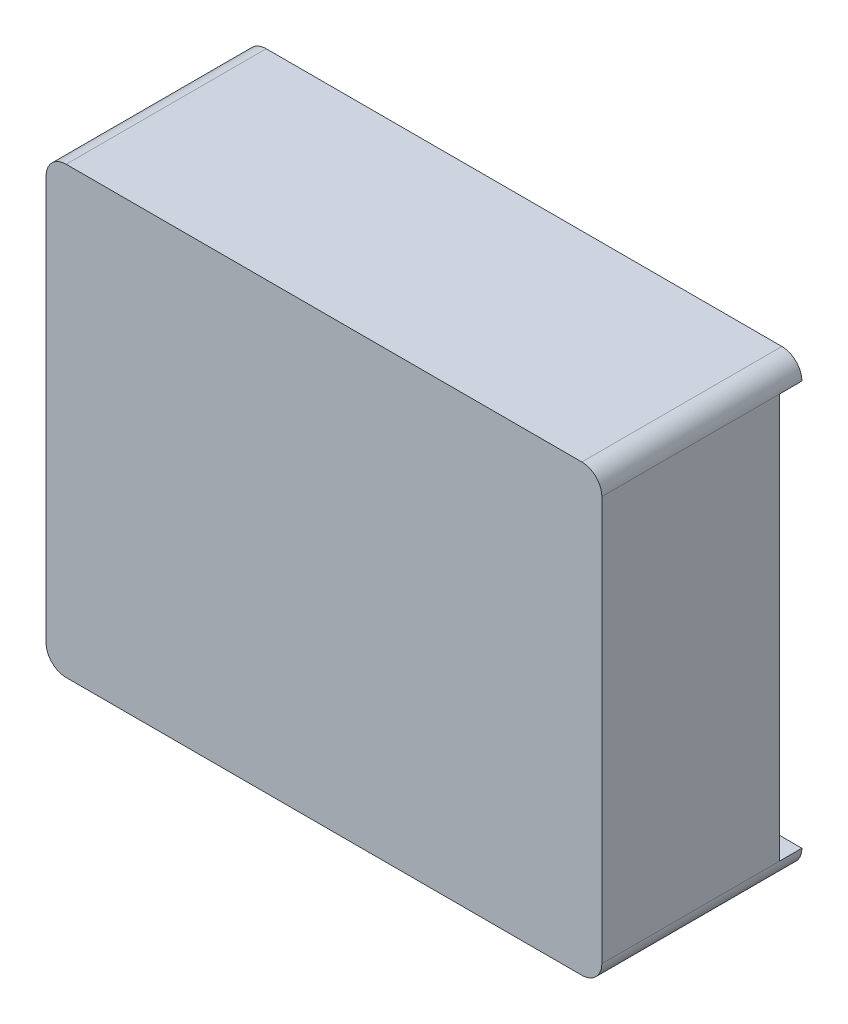
ISO-10303-21;
HEADER;
FILE_DESCRIPTION(('STEP AP214'),'2;1');
FILE_NAME('part.step','',(''),(''),'','','');
FILE_SCHEMA(('AUTOMOTIVE_DESIGN { 1 0 10303 214 1 1 1 1 }'));
ENDSEC;
DATA;
#1=APPLICATION_CONTEXT('core data for automotive mechanical design processes');
#2=APPLICATION_PROTOCOL_DEFINITION('international standard','automotive_design',2000,#1);
#3=PRODUCT_CONTEXT('',#1,'mechanical');
#4=PRODUCT('Part','Part','',(#3));
#5=PRODUCT_RELATED_PRODUCT_CATEGORY('part','',(#4));
#6=PRODUCT_DEFINITION_FORMATION('','',#4);
#7=PRODUCT_DEFINITION_CONTEXT('part definition',#1,'design');
#8=PRODUCT_DEFINITION('design','',#6,#7);
#9=PRODUCT_DEFINITION_SHAPE('','',#8);
#10=(LENGTH_UNIT() NAMED_UNIT(*) SI_UNIT(.MILLI.,.METRE.));
#11=(NAMED_UNIT(*) PLANE_ANGLE_UNIT() SI_UNIT($,.RADIAN.));
#12=(NAMED_UNIT(*) SI_UNIT($,.STERADIAN.) SOLID_ANGLE_UNIT());
#13=UNCERTAINTY_MEASURE_WITH_UNIT(LENGTH_MEASURE(1.E-05),#10,'distance_accuracy_value','');
#14=(GEOMETRIC_REPRESENTATION_CONTEXT(3) GLOBAL_UNCERTAINTY_ASSIGNED_CONTEXT((#13)) GLOBAL_UNIT_ASSIGNED_CONTEXT((#10,
#11,#12)) REPRESENTATION_CONTEXT('',''));
#15=CARTESIAN_POINT('',(0.,0.,0.));
#16=DIRECTION('',(0.,0.,1.));
#17=DIRECTION('',(1.,0.,0.));
#18=AXIS2_PLACEMENT_3D('',#15,#16,#17);
#19=CARTESIAN_POINT('',(0.,0.,0.1));
#20=DIRECTION('',(0.,0.,1.));
#21=DIRECTION('',(1.,0.,0.));
#22=AXIS2_PLACEMENT_3D('',#19,#20,#21);
#23=PLANE('',#22);
#24=DIRECTION('',(-1.,0.,0.));
#25=VECTOR('',#24,1.);
#26=CARTESIAN_POINT('',(1.25,-0.91,0.1));
#27=LINE('',#26,#25);
#28=CARTESIAN_POINT('',(1.25,-0.91,0.1));
#29=VERTEX_POINT('',#28);
#30=CARTESIAN_POINT('',(1.05,-0.91,0.1));
#31=VERTEX_POINT('',#30);
#32=EDGE_CURVE('E304',#29,#31,#27,.T.);
#33=ORIENTED_EDGE('',*,*,#32,.T.);
#34=DIRECTION('',(0.,1.,0.));
#35=VECTOR('',#34,1.);
#36=CARTESIAN_POINT('',(1.05,-0.91,0.1));
#37=LINE('',#36,#35);
#38=CARTESIAN_POINT('',(1.05,0.91,0.1));
#39=VERTEX_POINT('',#38);
#40=EDGE_CURVE('E242',#31,#39,#37,.T.);
#41=ORIENTED_EDGE('',*,*,#40,.T.);
#42=DIRECTION('',(1.,0.,0.));
#43=VECTOR('',#42,1.);
#44=CARTESIAN_POINT('',(1.05,0.91,0.1));
#45=LINE('',#44,#43);
#46=CARTESIAN_POINT('',(1.25,0.91,0.1));
#47=VERTEX_POINT('',#46);
#48=EDGE_CURVE('E243',#39,#47,#45,.T.);
#49=ORIENTED_EDGE('',*,*,#48,.T.);
#50=DIRECTION('',(0.,-1.,0.));
#51=VECTOR('',#50,1.);
#52=CARTESIAN_POINT('',(1.25,0.91,0.1));
#53=LINE('',#52,#51);
#54=EDGE_CURVE('E11',#47,#29,#53,.T.);
#55=ORIENTED_EDGE('',*,*,#54,.T.);
#56=EDGE_LOOP('',(#33,#41,#49,#55));
#57=FACE_BOUND('',#56,.T.);
#58=ADVANCED_FACE('F17',(#57),#23,.F.);
#59=CARTESIAN_POINT('',(1.25,-1.,0.));
#60=DIRECTION('',(-1.,0.,0.));
#61=DIRECTION('',(0.,0.,1.));
#62=AXIS2_PLACEMENT_3D('',#59,#60,#61);
#63=PLANE('',#62);
#64=ORIENTED_EDGE('',*,*,#54,.F.);
#65=DIRECTION('',(0.,0.,1.));
#66=VECTOR('',#65,1.);
#67=CARTESIAN_POINT('',(1.25,0.91,0.));
#68=LINE('',#67,#66);
#69=CARTESIAN_POINT('',(1.25,0.91,0.9));
#70=VERTEX_POINT('',#69);
#71=EDGE_CURVE('E282',#47,#70,#68,.T.);
#72=ORIENTED_EDGE('',*,*,#71,.T.);
#73=DIRECTION('',(0.,1.,0.));
#74=VECTOR('',#73,1.);
#75=CARTESIAN_POINT('',(1.25,-1.,0.9));
#76=LINE('',#75,#74);
#77=CARTESIAN_POINT('',(1.25,-0.91,0.9));
#78=VERTEX_POINT('',#77);
#79=EDGE_CURVE('E262',#78,#70,#76,.T.);
#80=ORIENTED_EDGE('',*,*,#79,.F.);
#81=DIRECTION('',(0.,0.,1.));
#82=VECTOR('',#81,1.);
#83=CARTESIAN_POINT('',(1.25,-0.91,0.));
#84=LINE('',#83,#82);
#85=EDGE_CURVE('E308',#29,#78,#84,.T.);
#86=ORIENTED_EDGE('',*,*,#85,.F.);
#87=EDGE_LOOP('',(#64,#72,#80,#86));
#88=FACE_BOUND('',#87,.T.);
#89=ADVANCED_FACE('F19',(#88),#63,.F.);
#90=CARTESIAN_POINT('',(0.,0.,0.1));
#91=DIRECTION('',(0.,0.,1.));
#92=DIRECTION('',(1.,0.,0.));
#93=AXIS2_PLACEMENT_3D('',#90,#91,#92);
#94=PLANE('',#93);
#95=DIRECTION('',(1.,0.,0.));
#96=VECTOR('',#95,1.);
#97=CARTESIAN_POINT('',(-1.25,-0.91,0.1));
#98=LINE('',#97,#96);
#99=CARTESIAN_POINT('',(-1.25,-0.91,0.1));
#100=VERTEX_POINT('',#99);
#101=CARTESIAN_POINT('',(-1.05,-0.91,0.1));
#102=VERTEX_POINT('',#101);
#103=EDGE_CURVE('E230',#100,#102,#98,.T.);
#104=ORIENTED_EDGE('',*,*,#103,.F.);
#105=DIRECTION('',(0.,-1.,0.));
#106=VECTOR('',#105,1.);
#107=CARTESIAN_POINT('',(-1.25,0.91,0.1));
#108=LINE('',#107,#106);
#109=CARTESIAN_POINT('',(-1.25,0.91,0.1));
#110=VERTEX_POINT('',#109);
#111=EDGE_CURVE('E166',#110,#100,#108,.T.);
#112=ORIENTED_EDGE('',*,*,#111,.F.);
#113=DIRECTION('',(-1.,0.,0.));
#114=VECTOR('',#113,1.);
#115=CARTESIAN_POINT('',(-1.05,0.91,0.1));
#116=LINE('',#115,#114);
#117=CARTESIAN_POINT('',(-1.05,0.91,0.1));
#118=VERTEX_POINT('',#117);
#119=EDGE_CURVE('E21',#118,#110,#116,.T.);
#120=ORIENTED_EDGE('',*,*,#119,.F.);
#121=DIRECTION('',(0.,1.,0.));
#122=VECTOR('',#121,1.);
#123=CARTESIAN_POINT('',(-1.05,-0.91,0.1));
#124=LINE('',#123,#122);
#125=EDGE_CURVE('E293',#102,#118,#124,.T.);
#126=ORIENTED_EDGE('',*,*,#125,.F.);
#127=EDGE_LOOP('',(#104,#112,#120,#126));
#128=FACE_BOUND('',#127,.T.);
#129=ADVANCED_FACE('F318',(#128),#94,.F.);
#130=CARTESIAN_POINT('',(-1.05,0.91,0.));
#131=DIRECTION('',(0.,-1.,0.));
#132=DIRECTION('',(0.,0.,-1.));
#133=AXIS2_PLACEMENT_3D('',#130,#131,#132);
#134=PLANE('',#133);
#135=DIRECTION('',(0.,0.,1.));
#136=VECTOR('',#135,1.);
#137=CARTESIAN_POINT('',(-1.05,0.91,0.));
#138=LINE('',#137,#136);
#139=CARTESIAN_POINT('',(-1.05,0.91,0.));
#140=VERTEX_POINT('',#139);
#141=EDGE_CURVE('E290',#140,#118,#138,.T.);
#142=ORIENTED_EDGE('',*,*,#141,.T.);
#143=ORIENTED_EDGE('',*,*,#119,.T.);
#144=DIRECTION('',(0.,0.,1.));
#145=VECTOR('',#144,1.);
#146=CARTESIAN_POINT('',(-1.25,0.91,0.));
#147=LINE('',#146,#145);
#148=CARTESIAN_POINT('',(-1.25,0.91,0.));
#149=VERTEX_POINT('',#148);
#150=EDGE_CURVE('E272',#149,#110,#147,.T.);
#151=ORIENTED_EDGE('',*,*,#150,.F.);
#152=DIRECTION('',(-1.,0.,0.));
#153=VECTOR('',#152,1.);
#154=CARTESIAN_POINT('',(-1.05,0.91,0.));
#155=LINE('',#154,#153);
#156=EDGE_CURVE('E226',#140,#149,#155,.T.);
#157=ORIENTED_EDGE('',*,*,#156,.F.);
#158=EDGE_LOOP('',(#142,#143,#151,#157));
#159=FACE_BOUND('',#158,.T.);
#160=ADVANCED_FACE('F374',(#159),#134,.T.);
#161=CARTESIAN_POINT('',(-1.05,-0.91,0.));
#162=DIRECTION('',(-1.,0.,0.));
#163=DIRECTION('',(0.,0.,1.));
#164=AXIS2_PLACEMENT_3D('',#161,#162,#163);
#165=PLANE('',#164);
#166=DIRECTION('',(0.,0.,1.));
#167=VECTOR('',#166,1.);
#168=CARTESIAN_POINT('',(-1.05,-0.91,0.));
#169=LINE('',#168,#167);
#170=CARTESIAN_POINT('',(-1.05,-0.91,0.));
#171=VERTEX_POINT('',#170);
#172=EDGE_CURVE('E234',#171,#102,#169,.T.);
#173=ORIENTED_EDGE('',*,*,#172,.T.);
#174=ORIENTED_EDGE('',*,*,#125,.T.);
#175=ORIENTED_EDGE('',*,*,#141,.F.);
#176=DIRECTION('',(0.,1.,0.));
#177=VECTOR('',#176,1.);
#178=CARTESIAN_POINT('',(-1.05,-0.91,0.));
#179=LINE('',#178,#177);
#180=EDGE_CURVE('E210',#171,#140,#179,.T.);
#181=ORIENTED_EDGE('',*,*,#180,.F.);
#182=EDGE_LOOP('',(#173,#174,#175,#181));
#183=FACE_BOUND('',#182,.T.);
#184=ADVANCED_FACE('F315',(#183),#165,.T.);
#185=CARTESIAN_POINT('',(1.16,-0.91,0.));
#186=DIRECTION('',(0.,0.,1.));
#187=DIRECTION('',(0.,-1.,0.));
#188=AXIS2_PLACEMENT_3D('',#185,#186,#187);
#189=CYLINDRICAL_SURFACE('',#188,0.09);
#190=CARTESIAN_POINT('',(1.16,-0.91,0.));
#191=DIRECTION('',(0.,0.,1.));
#192=DIRECTION('',(0.,-1.,0.));
#193=AXIS2_PLACEMENT_3D('',#190,#191,#192);
#194=CIRCLE('',#193,0.09);
#195=CARTESIAN_POINT('',(1.16,-1.,0.));
#196=VERTEX_POINT('',#195);
#197=CARTESIAN_POINT('',(1.25,-0.91,0.));
#198=VERTEX_POINT('',#197);
#199=EDGE_CURVE('E201',#196,#198,#194,.T.);
#200=ORIENTED_EDGE('',*,*,#199,.T.);
#201=DIRECTION('',(0.,0.,1.));
#202=VECTOR('',#201,1.);
#203=CARTESIAN_POINT('',(1.25,-0.91,0.));
#204=LINE('',#203,#202);
#205=EDGE_CURVE('E301',#198,#29,#204,.T.);
#206=ORIENTED_EDGE('',*,*,#205,.T.);
#207=ORIENTED_EDGE('',*,*,#85,.T.);
#208=CARTESIAN_POINT('',(1.16,-0.91,0.9));
#209=DIRECTION('',(0.,0.,1.));
#210=DIRECTION('',(0.,-1.,0.));
#211=AXIS2_PLACEMENT_3D('',#208,#209,#210);
#212=CIRCLE('',#211,0.09);
#213=CARTESIAN_POINT('',(1.16,-1.,0.9));
#214=VERTEX_POINT('',#213);
#215=EDGE_CURVE('E258',#214,#78,#212,.T.);
#216=ORIENTED_EDGE('',*,*,#215,.F.);
#217=DIRECTION('',(0.,0.,1.));
#218=VECTOR('',#217,1.);
#219=CARTESIAN_POINT('',(1.16,-1.,0.));
#220=LINE('',#219,#218);
#221=EDGE_CURVE('E251',#196,#214,#220,.T.);
#222=ORIENTED_EDGE('',*,*,#221,.F.);
#223=EDGE_LOOP('',(#200,#206,#207,#216,#222));
#224=FACE_BOUND('',#223,.T.);
#225=ADVANCED_FACE('F373',(#224),#189,.T.);
#226=CARTESIAN_POINT('',(1.25,-0.91,0.));
#227=DIRECTION('',(0.,-1.,0.));
#228=DIRECTION('',(0.,0.,-1.));
#229=AXIS2_PLACEMENT_3D('',#226,#227,#228);
#230=PLANE('',#229);
#231=ORIENTED_EDGE('',*,*,#205,.F.);
#232=DIRECTION('',(-1.,0.,0.));
#233=VECTOR('',#232,1.);
#234=CARTESIAN_POINT('',(1.25,-0.91,0.));
#235=LINE('',#234,#233);
#236=CARTESIAN_POINT('',(1.05,-0.91,0.));
#237=VERTEX_POINT('',#236);
#238=EDGE_CURVE('E197',#198,#237,#235,.T.);
#239=ORIENTED_EDGE('',*,*,#238,.T.);
#240=DIRECTION('',(0.,0.,1.));
#241=VECTOR('',#240,1.);
#242=CARTESIAN_POINT('',(1.05,-0.91,0.));
#243=LINE('',#242,#241);
#244=EDGE_CURVE('E238',#237,#31,#243,.T.);
#245=ORIENTED_EDGE('',*,*,#244,.T.);
#246=ORIENTED_EDGE('',*,*,#32,.F.);
#247=EDGE_LOOP('',(#231,#239,#245,#246));
#248=FACE_BOUND('',#247,.T.);
#249=ADVANCED_FACE('F362',(#248),#230,.F.);
#250=CARTESIAN_POINT('',(1.05,-0.91,0.));
#251=DIRECTION('',(-1.,0.,0.));
#252=DIRECTION('',(0.,0.,1.));
#253=AXIS2_PLACEMENT_3D('',#250,#251,#252);
#254=PLANE('',#253);
#255=ORIENTED_EDGE('',*,*,#244,.F.);
#256=DIRECTION('',(0.,1.,0.));
#257=VECTOR('',#256,1.);
#258=CARTESIAN_POINT('',(1.05,-0.91,0.));
#259=LINE('',#258,#257);
#260=CARTESIAN_POINT('',(1.05,0.91,0.));
#261=VERTEX_POINT('',#260);
#262=EDGE_CURVE('E202',#237,#261,#259,.T.);
#263=ORIENTED_EDGE('',*,*,#262,.T.);
#264=DIRECTION('',(0.,0.,1.));
#265=VECTOR('',#264,1.);
#266=CARTESIAN_POINT('',(1.05,0.91,0.));
#267=LINE('',#266,#265);
#268=EDGE_CURVE('E289',#261,#39,#267,.T.);
#269=ORIENTED_EDGE('',*,*,#268,.T.);
#270=ORIENTED_EDGE('',*,*,#40,.F.);
#271=EDGE_LOOP('',(#255,#263,#269,#270));
#272=FACE_BOUND('',#271,.T.);
#273=ADVANCED_FACE('F354',(#272),#254,.F.);
#274=CARTESIAN_POINT('',(1.05,0.91,0.));
#275=DIRECTION('',(0.,1.,0.));
#276=DIRECTION('',(1.,0.,0.));
#277=AXIS2_PLACEMENT_3D('',#274,#275,#276);
#278=PLANE('',#277);
#279=ORIENTED_EDGE('',*,*,#268,.F.);
#280=DIRECTION('',(1.,0.,0.));
#281=VECTOR('',#280,1.);
#282=CARTESIAN_POINT('',(1.05,0.91,0.));
#283=LINE('',#282,#281);
#284=CARTESIAN_POINT('',(1.25,0.91,0.));
#285=VERTEX_POINT('',#284);
#286=EDGE_CURVE('E222',#261,#285,#283,.T.);
#287=ORIENTED_EDGE('',*,*,#286,.T.);
#288=DIRECTION('',(0.,0.,1.));
#289=VECTOR('',#288,1.);
#290=CARTESIAN_POINT('',(1.25,0.91,0.));
#291=LINE('',#290,#289);
#292=EDGE_CURVE('E285',#285,#47,#291,.T.);
#293=ORIENTED_EDGE('',*,*,#292,.T.);
#294=ORIENTED_EDGE('',*,*,#48,.F.);
#295=EDGE_LOOP('',(#279,#287,#293,#294));
#296=FACE_BOUND('',#295,.T.);
#297=ADVANCED_FACE('F352',(#296),#278,.F.);
#298=CARTESIAN_POINT('',(1.16,0.91,0.));
#299=DIRECTION('',(0.,0.,1.));
#300=DIRECTION('',(1.,0.,0.));
#301=AXIS2_PLACEMENT_3D('',#298,#299,#300);
#302=CYLINDRICAL_SURFACE('',#301,0.09);
#303=CARTESIAN_POINT('',(1.16,0.91,0.));
#304=DIRECTION('',(0.,0.,1.));
#305=DIRECTION('',(0.,-1.,0.));
#306=AXIS2_PLACEMENT_3D('',#303,#304,#305);
#307=CIRCLE('',#306,0.09);
#308=CARTESIAN_POINT('',(1.16,1.,0.));
#309=VERTEX_POINT('',#308);
#310=EDGE_CURVE('E215',#285,#309,#307,.T.);
#311=ORIENTED_EDGE('',*,*,#310,.T.);
#312=DIRECTION('',(0.,0.,1.));
#313=VECTOR('',#312,1.);
#314=CARTESIAN_POINT('',(1.16,1.,0.));
#315=LINE('',#314,#313);
#316=CARTESIAN_POINT('',(1.16,1.,0.9));
#317=VERTEX_POINT('',#316);
#318=EDGE_CURVE('E279',#309,#317,#315,.T.);
#319=ORIENTED_EDGE('',*,*,#318,.T.);
#320=CARTESIAN_POINT('',(1.16,0.91,0.9));
#321=DIRECTION('',(0.,0.,1.));
#322=DIRECTION('',(0.,-1.,0.));
#323=AXIS2_PLACEMENT_3D('',#320,#321,#322);
#324=CIRCLE('',#323,0.09);
#325=EDGE_CURVE('E266',#70,#317,#324,.T.);
#326=ORIENTED_EDGE('',*,*,#325,.F.);
#327=ORIENTED_EDGE('',*,*,#71,.F.);
#328=ORIENTED_EDGE('',*,*,#292,.F.);
#329=EDGE_LOOP('',(#311,#319,#326,#327,#328));
#330=FACE_BOUND('',#329,.T.);
#331=ADVANCED_FACE('F340',(#330),#302,.T.);
#332=CARTESIAN_POINT('',(1.25,1.,0.));
#333=DIRECTION('',(0.,-1.,0.));
#334=DIRECTION('',(0.,0.,-1.));
#335=AXIS2_PLACEMENT_3D('',#332,#333,#334);
#336=PLANE('',#335);
#337=DIRECTION('',(-1.,0.,0.));
#338=VECTOR('',#337,1.);
#339=CARTESIAN_POINT('',(1.25,1.,0.));
#340=LINE('',#339,#338);
#341=CARTESIAN_POINT('',(-1.16,1.,0.));
#342=VERTEX_POINT('',#341);
#343=EDGE_CURVE('E195',#309,#342,#340,.T.);
#344=ORIENTED_EDGE('',*,*,#343,.T.);
#345=DIRECTION('',(0.,0.,1.));
#346=VECTOR('',#345,1.);
#347=CARTESIAN_POINT('',(-1.16,1.,0.));
#348=LINE('',#347,#346);
#349=CARTESIAN_POINT('',(-1.16,1.,0.9));
#350=VERTEX_POINT('',#349);
#351=EDGE_CURVE('E276',#342,#350,#348,.T.);
#352=ORIENTED_EDGE('',*,*,#351,.T.);
#353=DIRECTION('',(-1.,0.,0.));
#354=VECTOR('',#353,1.);
#355=CARTESIAN_POINT('',(1.25,1.,0.9));
#356=LINE('',#355,#354);
#357=EDGE_CURVE('E191',#317,#350,#356,.T.);
#358=ORIENTED_EDGE('',*,*,#357,.F.);
#359=ORIENTED_EDGE('',*,*,#318,.F.);
#360=EDGE_LOOP('',(#344,#352,#358,#359));
#361=FACE_BOUND('',#360,.T.);
#362=ADVANCED_FACE('F346',(#361),#336,.F.);
#363=CARTESIAN_POINT('',(-1.16,0.91,0.));
#364=DIRECTION('',(0.,0.,1.));
#365=DIRECTION('',(-1.,0.,0.));
#366=AXIS2_PLACEMENT_3D('',#363,#364,#365);
#367=CYLINDRICAL_SURFACE('',#366,0.09);
#368=CARTESIAN_POINT('',(-1.16,0.91,0.));
#369=DIRECTION('',(0.,0.,-1.));
#370=DIRECTION('',(0.,-1.,0.));
#371=AXIS2_PLACEMENT_3D('',#368,#369,#370);
#372=CIRCLE('',#371,0.09);
#373=EDGE_CURVE('E193',#149,#342,#372,.T.);
#374=ORIENTED_EDGE('',*,*,#373,.F.);
#375=ORIENTED_EDGE('',*,*,#150,.T.);
#376=DIRECTION('',(0.,0.,1.));
#377=VECTOR('',#376,1.);
#378=CARTESIAN_POINT('',(-1.25,0.91,0.));
#379=LINE('',#378,#377);
#380=CARTESIAN_POINT('',(-1.25,0.91,0.9));
#381=VERTEX_POINT('',#380);
#382=EDGE_CURVE('E165',#110,#381,#379,.T.);
#383=ORIENTED_EDGE('',*,*,#382,.T.);
#384=CARTESIAN_POINT('',(-1.16,0.91,0.9));
#385=DIRECTION('',(0.,0.,-1.));
#386=DIRECTION('',(0.,-1.,0.));
#387=AXIS2_PLACEMENT_3D('',#384,#385,#386);
#388=CIRCLE('',#387,0.09);
#389=EDGE_CURVE('E160',#381,#350,#388,.T.);
#390=ORIENTED_EDGE('',*,*,#389,.T.);
#391=ORIENTED_EDGE('',*,*,#351,.F.);
#392=EDGE_LOOP('',(#374,#375,#383,#390,#391));
#393=FACE_BOUND('',#392,.T.);
#394=ADVANCED_FACE('F377',(#393),#367,.T.);
#395=CARTESIAN_POINT('',(0.,0.,0.9));
#396=DIRECTION('',(0.,0.,1.));
#397=DIRECTION('',(1.,0.,0.));
#398=AXIS2_PLACEMENT_3D('',#395,#396,#397);
#399=PLANE('',#398);
#400=DIRECTION('',(0.,-1.,0.));
#401=VECTOR('',#400,1.);
#402=CARTESIAN_POINT('',(-1.25,1.,0.9));
#403=LINE('',#402,#401);
#404=CARTESIAN_POINT('',(-1.25,-0.91,0.9));
#405=VERTEX_POINT('',#404);
#406=EDGE_CURVE('E151',#381,#405,#403,.T.);
#407=ORIENTED_EDGE('',*,*,#406,.T.);
#408=CARTESIAN_POINT('',(-1.16,-0.91,0.9));
#409=DIRECTION('',(0.,0.,1.));
#410=DIRECTION('',(0.,-1.,0.));
#411=AXIS2_PLACEMENT_3D('',#408,#409,#410);
#412=CIRCLE('',#411,0.09);
#413=CARTESIAN_POINT('',(-1.16,-1.,0.9));
#414=VERTEX_POINT('',#413);
#415=EDGE_CURVE('E156',#405,#414,#412,.T.);
#416=ORIENTED_EDGE('',*,*,#415,.T.);
#417=DIRECTION('',(1.,0.,0.));
#418=VECTOR('',#417,1.);
#419=CARTESIAN_POINT('',(-1.25,-1.,0.9));
#420=LINE('',#419,#418);
#421=EDGE_CURVE('E255',#414,#214,#420,.T.);
#422=ORIENTED_EDGE('',*,*,#421,.T.);
#423=ORIENTED_EDGE('',*,*,#215,.T.);
#424=ORIENTED_EDGE('',*,*,#79,.T.);
#425=ORIENTED_EDGE('',*,*,#325,.T.);
#426=ORIENTED_EDGE('',*,*,#357,.T.);
#427=ORIENTED_EDGE('',*,*,#389,.F.);
#428=EDGE_LOOP('',(#407,#416,#422,#423,#424,#425,#426,#427));
#429=FACE_BOUND('',#428,.T.);
#430=ADVANCED_FACE('F153',(#429),#399,.T.);
#431=CARTESIAN_POINT('',(-1.25,-1.,0.));
#432=DIRECTION('',(0.,1.,0.));
#433=DIRECTION('',(1.,0.,0.));
#434=AXIS2_PLACEMENT_3D('',#431,#432,#433);
#435=PLANE('',#434);
#436=DIRECTION('',(1.,0.,0.));
#437=VECTOR('',#436,1.);
#438=CARTESIAN_POINT('',(-1.25,-1.,0.));
#439=LINE('',#438,#437);
#440=CARTESIAN_POINT('',(-1.16,-1.,0.));
#441=VERTEX_POINT('',#440);
#442=EDGE_CURVE('E211',#441,#196,#439,.T.);
#443=ORIENTED_EDGE('',*,*,#442,.T.);
#444=ORIENTED_EDGE('',*,*,#221,.T.);
#445=ORIENTED_EDGE('',*,*,#421,.F.);
#446=DIRECTION('',(0.,0.,1.));
#447=VECTOR('',#446,1.);
#448=CARTESIAN_POINT('',(-1.16,-1.,0.));
#449=LINE('',#448,#447);
#450=EDGE_CURVE('E180',#441,#414,#449,.T.);
#451=ORIENTED_EDGE('',*,*,#450,.F.);
#452=EDGE_LOOP('',(#443,#444,#445,#451));
#453=FACE_BOUND('',#452,.T.);
#454=ADVANCED_FACE('F383',(#453),#435,.F.);
#455=CARTESIAN_POINT('',(-1.25,1.,0.));
#456=DIRECTION('',(1.,0.,0.));
#457=DIRECTION('',(0.,1.,0.));
#458=AXIS2_PLACEMENT_3D('',#455,#456,#457);
#459=PLANE('',#458);
#460=ORIENTED_EDGE('',*,*,#111,.T.);
#461=DIRECTION('',(0.,0.,1.));
#462=VECTOR('',#461,1.);
#463=CARTESIAN_POINT('',(-1.25,-0.91,0.));
#464=LINE('',#463,#462);
#465=EDGE_CURVE('E169',#100,#405,#464,.T.);
#466=ORIENTED_EDGE('',*,*,#465,.T.);
#467=ORIENTED_EDGE('',*,*,#406,.F.);
#468=ORIENTED_EDGE('',*,*,#382,.F.);
#469=EDGE_LOOP('',(#460,#466,#467,#468));
#470=FACE_BOUND('',#469,.T.);
#471=ADVANCED_FACE('F170',(#470),#459,.F.);
#472=CARTESIAN_POINT('',(-1.25,-0.91,0.));
#473=DIRECTION('',(0.,1.,0.));
#474=DIRECTION('',(1.,0.,0.));
#475=AXIS2_PLACEMENT_3D('',#472,#473,#474);
#476=PLANE('',#475);
#477=DIRECTION('',(0.,0.,1.));
#478=VECTOR('',#477,1.);
#479=CARTESIAN_POINT('',(-1.25,-0.91,0.));
#480=LINE('',#479,#478);
#481=CARTESIAN_POINT('',(-1.25,-0.91,0.));
#482=VERTEX_POINT('',#481);
#483=EDGE_CURVE('E175',#482,#100,#480,.T.);
#484=ORIENTED_EDGE('',*,*,#483,.T.);
#485=ORIENTED_EDGE('',*,*,#103,.T.);
#486=ORIENTED_EDGE('',*,*,#172,.F.);
#487=DIRECTION('',(1.,0.,0.));
#488=VECTOR('',#487,1.);
#489=CARTESIAN_POINT('',(-1.25,-0.91,0.));
#490=LINE('',#489,#488);
#491=EDGE_CURVE('E206',#482,#171,#490,.T.);
#492=ORIENTED_EDGE('',*,*,#491,.F.);
#493=EDGE_LOOP('',(#484,#485,#486,#492));
#494=FACE_BOUND('',#493,.T.);
#495=ADVANCED_FACE('F320',(#494),#476,.T.);
#496=CARTESIAN_POINT('',(0.,0.,0.));
#497=DIRECTION('',(0.,0.,1.));
#498=DIRECTION('',(1.,0.,0.));
#499=AXIS2_PLACEMENT_3D('',#496,#497,#498);
#500=PLANE('',#499);
#501=ORIENTED_EDGE('',*,*,#373,.T.);
#502=ORIENTED_EDGE('',*,*,#343,.F.);
#503=ORIENTED_EDGE('',*,*,#310,.F.);
#504=ORIENTED_EDGE('',*,*,#286,.F.);
#505=ORIENTED_EDGE('',*,*,#262,.F.);
#506=ORIENTED_EDGE('',*,*,#238,.F.);
#507=ORIENTED_EDGE('',*,*,#199,.F.);
#508=ORIENTED_EDGE('',*,*,#442,.F.);
#509=CARTESIAN_POINT('',(-1.16,-0.91,0.));
#510=DIRECTION('',(0.,0.,1.));
#511=DIRECTION('',(0.,-1.,0.));
#512=AXIS2_PLACEMENT_3D('',#509,#510,#511);
#513=CIRCLE('',#512,0.09);
#514=EDGE_CURVE('E187',#482,#441,#513,.T.);
#515=ORIENTED_EDGE('',*,*,#514,.F.);
#516=ORIENTED_EDGE('',*,*,#491,.T.);
#517=ORIENTED_EDGE('',*,*,#180,.T.);
#518=ORIENTED_EDGE('',*,*,#156,.T.);
#519=EDGE_LOOP('',(#501,#502,#503,#504,#505,#506,#507,#508,#515,#516,#517,#518));
#520=FACE_BOUND('',#519,.T.);
#521=ADVANCED_FACE('F323',(#520),#500,.F.);
#522=CARTESIAN_POINT('',(-1.16,-0.91,0.));
#523=DIRECTION('',(0.,0.,1.));
#524=DIRECTION('',(-1.,0.,0.));
#525=AXIS2_PLACEMENT_3D('',#522,#523,#524);
#526=CYLINDRICAL_SURFACE('',#525,0.09);
#527=ORIENTED_EDGE('',*,*,#514,.T.);
#528=ORIENTED_EDGE('',*,*,#450,.T.);
#529=ORIENTED_EDGE('',*,*,#415,.F.);
#530=ORIENTED_EDGE('',*,*,#465,.F.);
#531=ORIENTED_EDGE('',*,*,#483,.F.);
#532=EDGE_LOOP('',(#527,#528,#529,#530,#531));
#533=FACE_BOUND('',#532,.T.);
#534=ADVANCED_FACE('F178',(#533),#526,.T.);
#535=CLOSED_SHELL('',(#58,#89,#129,#160,#184,#225,#249,#273,#297,#331,#362,#394,#430,#454,#471,
#495,#521,#534));
#536=MANIFOLD_SOLID_BREP('B1',#535);
#537=ADVANCED_BREP_SHAPE_REPRESENTATION('',(#18,#536),#14);
#538=SHAPE_DEFINITION_REPRESENTATION(#9,#537);
ENDSEC;
END-ISO-10303-21;
